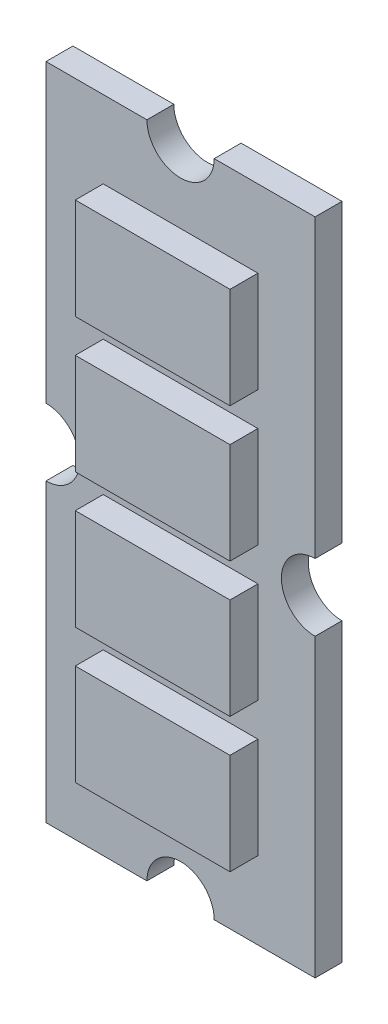
ISO-10303-21;
HEADER;
FILE_DESCRIPTION(('STEP AP214'),'2;1');
FILE_NAME('part.step','',(''),(''),'','','');
FILE_SCHEMA(('AUTOMOTIVE_DESIGN { 1 0 10303 214 1 1 1 1 }'));
ENDSEC;
DATA;
#1=APPLICATION_CONTEXT('core data for automotive mechanical design processes');
#2=APPLICATION_PROTOCOL_DEFINITION('international standard','automotive_design',2000,#1);
#3=PRODUCT_CONTEXT('',#1,'mechanical');
#4=PRODUCT('Part','Part','',(#3));
#5=PRODUCT_RELATED_PRODUCT_CATEGORY('part','',(#4));
#6=PRODUCT_DEFINITION_FORMATION('','',#4);
#7=PRODUCT_DEFINITION_CONTEXT('part definition',#1,'design');
#8=PRODUCT_DEFINITION('design','',#6,#7);
#9=PRODUCT_DEFINITION_SHAPE('','',#8);
#10=(LENGTH_UNIT() NAMED_UNIT(*) SI_UNIT(.MILLI.,.METRE.));
#11=(NAMED_UNIT(*) PLANE_ANGLE_UNIT() SI_UNIT($,.RADIAN.));
#12=(NAMED_UNIT(*) SI_UNIT($,.STERADIAN.) SOLID_ANGLE_UNIT());
#13=UNCERTAINTY_MEASURE_WITH_UNIT(LENGTH_MEASURE(1.E-05),#10,'distance_accuracy_value','');
#14=(GEOMETRIC_REPRESENTATION_CONTEXT(3) GLOBAL_UNCERTAINTY_ASSIGNED_CONTEXT((#13)) GLOBAL_UNIT_ASSIGNED_CONTEXT((#10,
#11,#12)) REPRESENTATION_CONTEXT('',''));
#15=CARTESIAN_POINT('',(0.,0.,0.));
#16=DIRECTION('',(0.,0.,1.));
#17=DIRECTION('',(1.,0.,0.));
#18=AXIS2_PLACEMENT_3D('',#15,#16,#17);
#19=CARTESIAN_POINT('',(-3.80238716478813,-26.6459336239174,0.8));
#20=DIRECTION('',(0.,0.,1.));
#21=DIRECTION('',(1.,0.,0.));
#22=AXIS2_PLACEMENT_3D('',#19,#20,#21);
#23=PLANE('',#22);
#24=DIRECTION('',(0.,-1.,0.));
#25=VECTOR('',#24,1.);
#26=CARTESIAN_POINT('',(-2.10238716478813,-19.1459336239174,0.8));
#27=LINE('',#26,#25);
#28=CARTESIAN_POINT('',(-2.10238716478813,-19.1459336239174,0.8));
#29=VERTEX_POINT('',#28);
#30=CARTESIAN_POINT('',(-2.10238716478813,-22.1459336239174,0.8));
#31=VERTEX_POINT('',#30);
#32=EDGE_CURVE('E318',#29,#31,#27,.T.);
#33=ORIENTED_EDGE('',*,*,#32,.F.);
#34=DIRECTION('',(-1.,0.,0.));
#35=VECTOR('',#34,1.);
#36=CARTESIAN_POINT('',(-2.10238716478813,-19.1459336239174,0.8));
#37=LINE('',#36,#35);
#38=CARTESIAN_POINT('',(2.49761283521187,-19.1459336239174,0.8));
#39=VERTEX_POINT('',#38);
#40=EDGE_CURVE('E323',#39,#29,#37,.T.);
#41=ORIENTED_EDGE('',*,*,#40,.F.);
#42=DIRECTION('',(0.,1.,0.));
#43=VECTOR('',#42,1.);
#44=CARTESIAN_POINT('',(2.49761283521187,-19.1459336239174,0.8));
#45=LINE('',#44,#43);
#46=CARTESIAN_POINT('',(2.49761283521188,-22.1459336239174,0.8));
#47=VERTEX_POINT('',#46);
#48=EDGE_CURVE('E335',#47,#39,#45,.T.);
#49=ORIENTED_EDGE('',*,*,#48,.F.);
#50=DIRECTION('',(1.,0.,0.));
#51=VECTOR('',#50,1.);
#52=CARTESIAN_POINT('',(-2.10238716478813,-22.1459336239174,0.8));
#53=LINE('',#52,#51);
#54=EDGE_CURVE('E332',#31,#47,#53,.T.);
#55=ORIENTED_EDGE('',*,*,#54,.F.);
#56=EDGE_LOOP('',(#33,#41,#49,#55));
#57=FACE_BOUND('',#56,.T.);
#58=DIRECTION('',(0.,-1.,0.));
#59=VECTOR('',#58,1.);
#60=CARTESIAN_POINT('',(-3.80238716478813,-16.8459336239174,0.8));
#61=LINE('',#60,#59);
#62=CARTESIAN_POINT('',(-3.80238716478813,-16.8459336239174,0.8));
#63=VERTEX_POINT('',#62);
#64=CARTESIAN_POINT('',(-3.80238716478813,-25.6459336239174,0.8));
#65=VERTEX_POINT('',#64);
#66=EDGE_CURVE('E352',#63,#65,#61,.T.);
#67=ORIENTED_EDGE('',*,*,#66,.T.);
#68=CARTESIAN_POINT('',(-3.80238716478813,-26.6459336239174,0.8));
#69=DIRECTION('',(0.,0.,-1.));
#70=DIRECTION('',(1.,0.,0.));
#71=AXIS2_PLACEMENT_3D('',#68,#69,#70);
#72=CIRCLE('',#71,1.);
#73=CARTESIAN_POINT('',(-3.80238716478813,-27.6459336239174,0.8));
#74=VERTEX_POINT('',#73);
#75=EDGE_CURVE('E355',#65,#74,#72,.T.);
#76=ORIENTED_EDGE('',*,*,#75,.T.);
#77=DIRECTION('',(0.,-1.,0.));
#78=VECTOR('',#77,1.);
#79=CARTESIAN_POINT('',(-3.80238716478813,-27.6459336239174,0.8));
#80=LINE('',#79,#78);
#81=CARTESIAN_POINT('',(-3.80238716478812,-36.4459336239174,0.8));
#82=VERTEX_POINT('',#81);
#83=EDGE_CURVE('E358',#74,#82,#80,.T.);
#84=ORIENTED_EDGE('',*,*,#83,.T.);
#85=DIRECTION('',(1.,0.,0.));
#86=VECTOR('',#85,1.);
#87=CARTESIAN_POINT('',(-3.80238716478812,-36.4459336239174,0.8));
#88=LINE('',#87,#86);
#89=CARTESIAN_POINT('',(-0.802387164788125,-36.4459336239174,0.8));
#90=VERTEX_POINT('',#89);
#91=EDGE_CURVE('E360',#82,#90,#88,.T.);
#92=ORIENTED_EDGE('',*,*,#91,.T.);
#93=CARTESIAN_POINT('',(0.197612835211876,-36.4459336239174,0.8));
#94=DIRECTION('',(0.,0.,-1.));
#95=DIRECTION('',(1.,0.,0.));
#96=AXIS2_PLACEMENT_3D('',#93,#94,#95);
#97=CIRCLE('',#96,1.);
#98=CARTESIAN_POINT('',(1.19761283521188,-36.4459336239174,0.8));
#99=VERTEX_POINT('',#98);
#100=EDGE_CURVE('E362',#90,#99,#97,.T.);
#101=ORIENTED_EDGE('',*,*,#100,.T.);
#102=DIRECTION('',(1.,0.,0.));
#103=VECTOR('',#102,1.);
#104=CARTESIAN_POINT('',(1.19761283521188,-36.4459336239174,0.8));
#105=LINE('',#104,#103);
#106=CARTESIAN_POINT('',(4.19761283521188,-36.4459336239174,0.8));
#107=VERTEX_POINT('',#106);
#108=EDGE_CURVE('E364',#99,#107,#105,.T.);
#109=ORIENTED_EDGE('',*,*,#108,.T.);
#110=DIRECTION('',(0.,1.,0.));
#111=VECTOR('',#110,1.);
#112=CARTESIAN_POINT('',(4.19761283521188,-27.6459336239174,0.8));
#113=LINE('',#112,#111);
#114=CARTESIAN_POINT('',(4.19761283521188,-27.6459336239174,0.8));
#115=VERTEX_POINT('',#114);
#116=EDGE_CURVE('E366',#107,#115,#113,.T.);
#117=ORIENTED_EDGE('',*,*,#116,.T.);
#118=CARTESIAN_POINT('',(4.19761283521188,-26.6459336239174,0.8));
#119=DIRECTION('',(0.,0.,-1.));
#120=DIRECTION('',(1.,0.,0.));
#121=AXIS2_PLACEMENT_3D('',#118,#119,#120);
#122=CIRCLE('',#121,1.);
#123=CARTESIAN_POINT('',(4.19761283521188,-25.6459336239174,0.8));
#124=VERTEX_POINT('',#123);
#125=EDGE_CURVE('E368',#115,#124,#122,.T.);
#126=ORIENTED_EDGE('',*,*,#125,.T.);
#127=DIRECTION('',(0.,1.,0.));
#128=VECTOR('',#127,1.);
#129=CARTESIAN_POINT('',(4.19761283521187,-16.8459336239174,0.8));
#130=LINE('',#129,#128);
#131=CARTESIAN_POINT('',(4.19761283521187,-16.8459336239174,0.8));
#132=VERTEX_POINT('',#131);
#133=EDGE_CURVE('E370',#124,#132,#130,.T.);
#134=ORIENTED_EDGE('',*,*,#133,.T.);
#135=DIRECTION('',(-1.,0.,0.));
#136=VECTOR('',#135,1.);
#137=CARTESIAN_POINT('',(1.19761283521187,-16.8459336239174,0.8));
#138=LINE('',#137,#136);
#139=CARTESIAN_POINT('',(1.19761283521187,-16.8459336239174,0.8));
#140=VERTEX_POINT('',#139);
#141=EDGE_CURVE('E372',#132,#140,#138,.T.);
#142=ORIENTED_EDGE('',*,*,#141,.T.);
#143=CARTESIAN_POINT('',(0.197612835211873,-16.8459336239174,0.8));
#144=DIRECTION('',(0.,0.,-1.));
#145=DIRECTION('',(1.,0.,0.));
#146=AXIS2_PLACEMENT_3D('',#143,#144,#145);
#147=CIRCLE('',#146,1.);
#148=CARTESIAN_POINT('',(-0.802387164788127,-16.8459336239174,0.8));
#149=VERTEX_POINT('',#148);
#150=EDGE_CURVE('E374',#140,#149,#147,.T.);
#151=ORIENTED_EDGE('',*,*,#150,.T.);
#152=DIRECTION('',(-1.,0.,0.));
#153=VECTOR('',#152,1.);
#154=CARTESIAN_POINT('',(-3.80238716478813,-16.8459336239174,0.8));
#155=LINE('',#154,#153);
#156=EDGE_CURVE('E376',#149,#63,#155,.T.);
#157=ORIENTED_EDGE('',*,*,#156,.T.);
#158=EDGE_LOOP('',(#67,#76,#84,#92,#101,#109,#117,#126,#134,#142,#151,#157));
#159=FACE_BOUND('',#158,.T.);
#160=DIRECTION('',(-1.,0.,0.));
#161=VECTOR('',#160,1.);
#162=CARTESIAN_POINT('',(-2.10238716478813,-31.1459336239174,0.8));
#163=LINE('',#162,#161);
#164=CARTESIAN_POINT('',(2.49761283521188,-31.1459336239174,0.8));
#165=VERTEX_POINT('',#164);
#166=CARTESIAN_POINT('',(-2.10238716478813,-31.1459336239174,0.8));
#167=VERTEX_POINT('',#166);
#168=EDGE_CURVE('E303',#165,#167,#163,.T.);
#169=ORIENTED_EDGE('',*,*,#168,.F.);
#170=DIRECTION('',(0.,1.,0.));
#171=VECTOR('',#170,1.);
#172=CARTESIAN_POINT('',(2.49761283521188,-31.1459336239174,0.8));
#173=LINE('',#172,#171);
#174=CARTESIAN_POINT('',(2.49761283521188,-34.1459336239174,0.8));
#175=VERTEX_POINT('',#174);
#176=EDGE_CURVE('E289',#175,#165,#173,.T.);
#177=ORIENTED_EDGE('',*,*,#176,.F.);
#178=DIRECTION('',(1.,0.,0.));
#179=VECTOR('',#178,1.);
#180=CARTESIAN_POINT('',(-2.10238716478812,-34.1459336239174,0.8));
#181=LINE('',#180,#179);
#182=CARTESIAN_POINT('',(-2.10238716478812,-34.1459336239174,0.8));
#183=VERTEX_POINT('',#182);
#184=EDGE_CURVE('E294',#183,#175,#181,.T.);
#185=ORIENTED_EDGE('',*,*,#184,.F.);
#186=DIRECTION('',(0.,-1.,0.));
#187=VECTOR('',#186,1.);
#188=CARTESIAN_POINT('',(-2.10238716478813,-31.1459336239174,0.8));
#189=LINE('',#188,#187);
#190=EDGE_CURVE('E305',#167,#183,#189,.T.);
#191=ORIENTED_EDGE('',*,*,#190,.F.);
#192=EDGE_LOOP('',(#169,#177,#185,#191));
#193=FACE_BOUND('',#192,.T.);
#194=DIRECTION('',(-1.,0.,0.));
#195=VECTOR('',#194,1.);
#196=CARTESIAN_POINT('',(-2.10238716478813,-23.1459336239174,0.8));
#197=LINE('',#196,#195);
#198=CARTESIAN_POINT('',(2.49761283521188,-23.1459336239174,0.8));
#199=VERTEX_POINT('',#198);
#200=CARTESIAN_POINT('',(-2.10238716478813,-23.1459336239174,0.8));
#201=VERTEX_POINT('',#200);
#202=EDGE_CURVE('E261',#199,#201,#197,.T.);
#203=ORIENTED_EDGE('',*,*,#202,.F.);
#204=DIRECTION('',(0.,1.,0.));
#205=VECTOR('',#204,1.);
#206=CARTESIAN_POINT('',(2.49761283521188,-23.1459336239174,0.8));
#207=LINE('',#206,#205);
#208=CARTESIAN_POINT('',(2.49761283521188,-26.1459336239174,0.8));
#209=VERTEX_POINT('',#208);
#210=EDGE_CURVE('E258',#209,#199,#207,.T.);
#211=ORIENTED_EDGE('',*,*,#210,.F.);
#212=DIRECTION('',(1.,0.,0.));
#213=VECTOR('',#212,1.);
#214=CARTESIAN_POINT('',(-2.10238716478813,-26.1459336239174,0.8));
#215=LINE('',#214,#213);
#216=CARTESIAN_POINT('',(-2.10238716478813,-26.1459336239174,0.8));
#217=VERTEX_POINT('',#216);
#218=EDGE_CURVE('E270',#217,#209,#215,.T.);
#219=ORIENTED_EDGE('',*,*,#218,.F.);
#220=DIRECTION('',(0.,-1.,0.));
#221=VECTOR('',#220,1.);
#222=CARTESIAN_POINT('',(-2.10238716478813,-23.1459336239174,0.8));
#223=LINE('',#222,#221);
#224=EDGE_CURVE('E278',#201,#217,#223,.T.);
#225=ORIENTED_EDGE('',*,*,#224,.F.);
#226=EDGE_LOOP('',(#203,#211,#219,#225));
#227=FACE_BOUND('',#226,.T.);
#228=DIRECTION('',(-1.,0.,0.));
#229=VECTOR('',#228,1.);
#230=CARTESIAN_POINT('',(-2.10238716478813,-27.1459336239174,0.8));
#231=LINE('',#230,#229);
#232=CARTESIAN_POINT('',(2.49761283521188,-27.1459336239174,0.8));
#233=VERTEX_POINT('',#232);
#234=CARTESIAN_POINT('',(-2.10238716478813,-27.1459336239174,0.8));
#235=VERTEX_POINT('',#234);
#236=EDGE_CURVE('E802',#233,#235,#231,.T.);
#237=ORIENTED_EDGE('',*,*,#236,.F.);
#238=DIRECTION('',(0.,1.,0.));
#239=VECTOR('',#238,1.);
#240=CARTESIAN_POINT('',(2.49761283521188,-27.1459336239174,0.8));
#241=LINE('',#240,#239);
#242=CARTESIAN_POINT('',(2.49761283521188,-30.1459336239174,0.8));
#243=VERTEX_POINT('',#242);
#244=EDGE_CURVE('E256',#243,#233,#241,.T.);
#245=ORIENTED_EDGE('',*,*,#244,.F.);
#246=DIRECTION('',(1.,0.,0.));
#247=VECTOR('',#246,1.);
#248=CARTESIAN_POINT('',(-2.10238716478813,-30.1459336239174,0.8));
#249=LINE('',#248,#247);
#250=CARTESIAN_POINT('',(-2.10238716478813,-30.1459336239174,0.8));
#251=VERTEX_POINT('',#250);
#252=EDGE_CURVE('E252',#251,#243,#249,.T.);
#253=ORIENTED_EDGE('',*,*,#252,.F.);
#254=DIRECTION('',(0.,-1.,0.));
#255=VECTOR('',#254,1.);
#256=CARTESIAN_POINT('',(-2.10238716478813,-27.1459336239174,0.8));
#257=LINE('',#256,#255);
#258=EDGE_CURVE('E799',#235,#251,#257,.T.);
#259=ORIENTED_EDGE('',*,*,#258,.F.);
#260=EDGE_LOOP('',(#237,#245,#253,#259));
#261=FACE_BOUND('',#260,.T.);
#262=ADVANCED_FACE('F47',(#57,#159,#193,#227,#261),#23,.T.);
#263=CARTESIAN_POINT('',(-3.80238716478813,-16.8459336239174,0.8));
#264=DIRECTION('',(1.,0.,0.));
#265=DIRECTION('',(0.,1.,0.));
#266=AXIS2_PLACEMENT_3D('',#263,#264,#265);
#267=PLANE('',#266);
#268=DIRECTION('',(0.,-1.,0.));
#269=VECTOR('',#268,1.);
#270=CARTESIAN_POINT('',(-3.80238716478813,-16.8459336239174,0.));
#271=LINE('',#270,#269);
#272=CARTESIAN_POINT('',(-3.80238716478813,-16.8459336239174,0.));
#273=VERTEX_POINT('',#272);
#274=CARTESIAN_POINT('',(-3.80238716478813,-25.6459336239174,0.));
#275=VERTEX_POINT('',#274);
#276=EDGE_CURVE('E351',#273,#275,#271,.T.);
#277=ORIENTED_EDGE('',*,*,#276,.T.);
#278=DIRECTION('',(0.,0.,-1.));
#279=VECTOR('',#278,1.);
#280=CARTESIAN_POINT('',(-3.80238716478813,-25.6459336239174,0.8));
#281=LINE('',#280,#279);
#282=EDGE_CURVE('E13',#65,#275,#281,.T.);
#283=ORIENTED_EDGE('',*,*,#282,.F.);
#284=ORIENTED_EDGE('',*,*,#66,.F.);
#285=DIRECTION('',(0.,0.,-1.));
#286=VECTOR('',#285,1.);
#287=CARTESIAN_POINT('',(-3.80238716478813,-16.8459336239174,0.8));
#288=LINE('',#287,#286);
#289=EDGE_CURVE('E378',#63,#273,#288,.T.);
#290=ORIENTED_EDGE('',*,*,#289,.T.);
#291=EDGE_LOOP('',(#277,#283,#284,#290));
#292=FACE_BOUND('',#291,.T.);
#293=ADVANCED_FACE('F49',(#292),#267,.F.);
#294=CARTESIAN_POINT('',(-3.80238716478813,-26.6459336239174,0.8));
#295=DIRECTION('',(0.,0.,-1.));
#296=DIRECTION('',(-1.,0.,0.));
#297=AXIS2_PLACEMENT_3D('',#294,#295,#296);
#298=CYLINDRICAL_SURFACE('',#297,1.);
#299=CARTESIAN_POINT('',(-3.80238716478813,-26.6459336239174,0.));
#300=DIRECTION('',(0.,0.,-1.));
#301=DIRECTION('',(1.,0.,0.));
#302=AXIS2_PLACEMENT_3D('',#299,#300,#301);
#303=CIRCLE('',#302,1.);
#304=CARTESIAN_POINT('',(-3.80238716478813,-27.6459336239174,0.));
#305=VERTEX_POINT('',#304);
#306=EDGE_CURVE('E381',#275,#305,#303,.T.);
#307=ORIENTED_EDGE('',*,*,#306,.T.);
#308=DIRECTION('',(0.,0.,-1.));
#309=VECTOR('',#308,1.);
#310=CARTESIAN_POINT('',(-3.80238716478813,-27.6459336239174,0.8));
#311=LINE('',#310,#309);
#312=EDGE_CURVE('E55',#74,#305,#311,.T.);
#313=ORIENTED_EDGE('',*,*,#312,.F.);
#314=ORIENTED_EDGE('',*,*,#75,.F.);
#315=ORIENTED_EDGE('',*,*,#282,.T.);
#316=EDGE_LOOP('',(#307,#313,#314,#315));
#317=FACE_BOUND('',#316,.T.);
#318=ADVANCED_FACE('F458',(#317),#298,.F.);
#319=CARTESIAN_POINT('',(-3.80238716478813,-27.6459336239174,0.8));
#320=DIRECTION('',(1.,0.,0.));
#321=DIRECTION('',(0.,1.,0.));
#322=AXIS2_PLACEMENT_3D('',#319,#320,#321);
#323=PLANE('',#322);
#324=DIRECTION('',(0.,-1.,0.));
#325=VECTOR('',#324,1.);
#326=CARTESIAN_POINT('',(-3.80238716478813,-27.6459336239174,0.));
#327=LINE('',#326,#325);
#328=CARTESIAN_POINT('',(-3.80238716478812,-36.4459336239174,0.));
#329=VERTEX_POINT('',#328);
#330=EDGE_CURVE('E383',#305,#329,#327,.T.);
#331=ORIENTED_EDGE('',*,*,#330,.T.);
#332=DIRECTION('',(0.,0.,-1.));
#333=VECTOR('',#332,1.);
#334=CARTESIAN_POINT('',(-3.80238716478812,-36.4459336239174,0.8));
#335=LINE('',#334,#333);
#336=EDGE_CURVE('E428',#82,#329,#335,.T.);
#337=ORIENTED_EDGE('',*,*,#336,.F.);
#338=ORIENTED_EDGE('',*,*,#83,.F.);
#339=ORIENTED_EDGE('',*,*,#312,.T.);
#340=EDGE_LOOP('',(#331,#337,#338,#339));
#341=FACE_BOUND('',#340,.T.);
#342=ADVANCED_FACE('F435',(#341),#323,.F.);
#343=CARTESIAN_POINT('',(-3.80238716478812,-36.4459336239174,0.8));
#344=DIRECTION('',(0.,1.,0.));
#345=DIRECTION('',(0.,0.,1.));
#346=AXIS2_PLACEMENT_3D('',#343,#344,#345);
#347=PLANE('',#346);
#348=DIRECTION('',(1.,0.,0.));
#349=VECTOR('',#348,1.);
#350=CARTESIAN_POINT('',(-3.80238716478812,-36.4459336239174,0.));
#351=LINE('',#350,#349);
#352=CARTESIAN_POINT('',(-0.802387164788125,-36.4459336239174,0.));
#353=VERTEX_POINT('',#352);
#354=EDGE_CURVE('E385',#329,#353,#351,.T.);
#355=ORIENTED_EDGE('',*,*,#354,.T.);
#356=DIRECTION('',(0.,0.,-1.));
#357=VECTOR('',#356,1.);
#358=CARTESIAN_POINT('',(-0.802387164788125,-36.4459336239174,0.8));
#359=LINE('',#358,#357);
#360=EDGE_CURVE('E425',#90,#353,#359,.T.);
#361=ORIENTED_EDGE('',*,*,#360,.F.);
#362=ORIENTED_EDGE('',*,*,#91,.F.);
#363=ORIENTED_EDGE('',*,*,#336,.T.);
#364=EDGE_LOOP('',(#355,#361,#362,#363));
#365=FACE_BOUND('',#364,.T.);
#366=ADVANCED_FACE('F446',(#365),#347,.F.);
#367=CARTESIAN_POINT('',(0.197612835211876,-36.4459336239174,0.8));
#368=DIRECTION('',(0.,0.,-1.));
#369=DIRECTION('',(-1.,0.,0.));
#370=AXIS2_PLACEMENT_3D('',#367,#368,#369);
#371=CYLINDRICAL_SURFACE('',#370,1.);
#372=CARTESIAN_POINT('',(0.197612835211876,-36.4459336239174,0.));
#373=DIRECTION('',(0.,0.,-1.));
#374=DIRECTION('',(1.,0.,0.));
#375=AXIS2_PLACEMENT_3D('',#372,#373,#374);
#376=CIRCLE('',#375,1.);
#377=CARTESIAN_POINT('',(1.19761283521188,-36.4459336239174,0.));
#378=VERTEX_POINT('',#377);
#379=EDGE_CURVE('E387',#353,#378,#376,.T.);
#380=ORIENTED_EDGE('',*,*,#379,.T.);
#381=DIRECTION('',(0.,0.,-1.));
#382=VECTOR('',#381,1.);
#383=CARTESIAN_POINT('',(1.19761283521188,-36.4459336239174,0.8));
#384=LINE('',#383,#382);
#385=EDGE_CURVE('E422',#99,#378,#384,.T.);
#386=ORIENTED_EDGE('',*,*,#385,.F.);
#387=ORIENTED_EDGE('',*,*,#100,.F.);
#388=ORIENTED_EDGE('',*,*,#360,.T.);
#389=EDGE_LOOP('',(#380,#386,#387,#388));
#390=FACE_BOUND('',#389,.T.);
#391=ADVANCED_FACE('F450',(#390),#371,.F.);
#392=CARTESIAN_POINT('',(1.19761283521188,-36.4459336239174,0.8));
#393=DIRECTION('',(0.,1.,0.));
#394=DIRECTION('',(0.,0.,1.));
#395=AXIS2_PLACEMENT_3D('',#392,#393,#394);
#396=PLANE('',#395);
#397=DIRECTION('',(1.,0.,0.));
#398=VECTOR('',#397,1.);
#399=CARTESIAN_POINT('',(1.19761283521188,-36.4459336239174,0.));
#400=LINE('',#399,#398);
#401=CARTESIAN_POINT('',(4.19761283521188,-36.4459336239174,0.));
#402=VERTEX_POINT('',#401);
#403=EDGE_CURVE('E389',#378,#402,#400,.T.);
#404=ORIENTED_EDGE('',*,*,#403,.T.);
#405=DIRECTION('',(0.,0.,-1.));
#406=VECTOR('',#405,1.);
#407=CARTESIAN_POINT('',(4.19761283521188,-36.4459336239174,0.8));
#408=LINE('',#407,#406);
#409=EDGE_CURVE('E419',#107,#402,#408,.T.);
#410=ORIENTED_EDGE('',*,*,#409,.F.);
#411=ORIENTED_EDGE('',*,*,#108,.F.);
#412=ORIENTED_EDGE('',*,*,#385,.T.);
#413=EDGE_LOOP('',(#404,#410,#411,#412));
#414=FACE_BOUND('',#413,.T.);
#415=ADVANCED_FACE('F491',(#414),#396,.F.);
#416=CARTESIAN_POINT('',(4.19761283521188,-27.6459336239174,0.8));
#417=DIRECTION('',(-1.,0.,0.));
#418=DIRECTION('',(0.,-1.,0.));
#419=AXIS2_PLACEMENT_3D('',#416,#417,#418);
#420=PLANE('',#419);
#421=DIRECTION('',(0.,1.,0.));
#422=VECTOR('',#421,1.);
#423=CARTESIAN_POINT('',(4.19761283521188,-27.6459336239174,0.));
#424=LINE('',#423,#422);
#425=CARTESIAN_POINT('',(4.19761283521188,-27.6459336239174,0.));
#426=VERTEX_POINT('',#425);
#427=EDGE_CURVE('E391',#402,#426,#424,.T.);
#428=ORIENTED_EDGE('',*,*,#427,.T.);
#429=DIRECTION('',(0.,0.,-1.));
#430=VECTOR('',#429,1.);
#431=CARTESIAN_POINT('',(4.19761283521188,-27.6459336239174,0.8));
#432=LINE('',#431,#430);
#433=EDGE_CURVE('E416',#115,#426,#432,.T.);
#434=ORIENTED_EDGE('',*,*,#433,.F.);
#435=ORIENTED_EDGE('',*,*,#116,.F.);
#436=ORIENTED_EDGE('',*,*,#409,.T.);
#437=EDGE_LOOP('',(#428,#434,#435,#436));
#438=FACE_BOUND('',#437,.T.);
#439=ADVANCED_FACE('F489',(#438),#420,.F.);
#440=CARTESIAN_POINT('',(4.19761283521188,-26.6459336239174,0.8));
#441=DIRECTION('',(0.,0.,-1.));
#442=DIRECTION('',(-1.,0.,0.));
#443=AXIS2_PLACEMENT_3D('',#440,#441,#442);
#444=CYLINDRICAL_SURFACE('',#443,1.);
#445=CARTESIAN_POINT('',(4.19761283521188,-26.6459336239174,0.));
#446=DIRECTION('',(0.,0.,-1.));
#447=DIRECTION('',(1.,0.,0.));
#448=AXIS2_PLACEMENT_3D('',#445,#446,#447);
#449=CIRCLE('',#448,1.);
#450=CARTESIAN_POINT('',(4.19761283521188,-25.6459336239174,0.));
#451=VERTEX_POINT('',#450);
#452=EDGE_CURVE('E393',#426,#451,#449,.T.);
#453=ORIENTED_EDGE('',*,*,#452,.T.);
#454=DIRECTION('',(0.,0.,-1.));
#455=VECTOR('',#454,1.);
#456=CARTESIAN_POINT('',(4.19761283521188,-25.6459336239174,0.8));
#457=LINE('',#456,#455);
#458=EDGE_CURVE('E413',#124,#451,#457,.T.);
#459=ORIENTED_EDGE('',*,*,#458,.F.);
#460=ORIENTED_EDGE('',*,*,#125,.F.);
#461=ORIENTED_EDGE('',*,*,#433,.T.);
#462=EDGE_LOOP('',(#453,#459,#460,#461));
#463=FACE_BOUND('',#462,.T.);
#464=ADVANCED_FACE('F485',(#463),#444,.F.);
#465=CARTESIAN_POINT('',(4.19761283521187,-16.8459336239174,0.8));
#466=DIRECTION('',(-1.,0.,0.));
#467=DIRECTION('',(0.,-1.,0.));
#468=AXIS2_PLACEMENT_3D('',#465,#466,#467);
#469=PLANE('',#468);
#470=DIRECTION('',(0.,1.,0.));
#471=VECTOR('',#470,1.);
#472=CARTESIAN_POINT('',(4.19761283521187,-16.8459336239174,0.));
#473=LINE('',#472,#471);
#474=CARTESIAN_POINT('',(4.19761283521187,-16.8459336239174,0.));
#475=VERTEX_POINT('',#474);
#476=EDGE_CURVE('E395',#451,#475,#473,.T.);
#477=ORIENTED_EDGE('',*,*,#476,.T.);
#478=DIRECTION('',(0.,0.,-1.));
#479=VECTOR('',#478,1.);
#480=CARTESIAN_POINT('',(4.19761283521187,-16.8459336239174,0.8));
#481=LINE('',#480,#479);
#482=EDGE_CURVE('E410',#132,#475,#481,.T.);
#483=ORIENTED_EDGE('',*,*,#482,.F.);
#484=ORIENTED_EDGE('',*,*,#133,.F.);
#485=ORIENTED_EDGE('',*,*,#458,.T.);
#486=EDGE_LOOP('',(#477,#483,#484,#485));
#487=FACE_BOUND('',#486,.T.);
#488=ADVANCED_FACE('F480',(#487),#469,.F.);
#489=CARTESIAN_POINT('',(1.19761283521187,-16.8459336239174,0.8));
#490=DIRECTION('',(0.,-1.,0.));
#491=DIRECTION('',(0.,0.,-1.));
#492=AXIS2_PLACEMENT_3D('',#489,#490,#491);
#493=PLANE('',#492);
#494=DIRECTION('',(-1.,0.,0.));
#495=VECTOR('',#494,1.);
#496=CARTESIAN_POINT('',(1.19761283521187,-16.8459336239174,0.));
#497=LINE('',#496,#495);
#498=CARTESIAN_POINT('',(1.19761283521187,-16.8459336239174,0.));
#499=VERTEX_POINT('',#498);
#500=EDGE_CURVE('E397',#475,#499,#497,.T.);
#501=ORIENTED_EDGE('',*,*,#500,.T.);
#502=DIRECTION('',(0.,0.,-1.));
#503=VECTOR('',#502,1.);
#504=CARTESIAN_POINT('',(1.19761283521187,-16.8459336239174,0.8));
#505=LINE('',#504,#503);
#506=EDGE_CURVE('E407',#140,#499,#505,.T.);
#507=ORIENTED_EDGE('',*,*,#506,.F.);
#508=ORIENTED_EDGE('',*,*,#141,.F.);
#509=ORIENTED_EDGE('',*,*,#482,.T.);
#510=EDGE_LOOP('',(#501,#507,#508,#509));
#511=FACE_BOUND('',#510,.T.);
#512=ADVANCED_FACE('F474',(#511),#493,.F.);
#513=CARTESIAN_POINT('',(0.197612835211873,-16.8459336239174,0.8));
#514=DIRECTION('',(0.,0.,-1.));
#515=DIRECTION('',(-1.,0.,0.));
#516=AXIS2_PLACEMENT_3D('',#513,#514,#515);
#517=CYLINDRICAL_SURFACE('',#516,1.);
#518=CARTESIAN_POINT('',(0.197612835211873,-16.8459336239174,0.));
#519=DIRECTION('',(0.,0.,-1.));
#520=DIRECTION('',(1.,0.,0.));
#521=AXIS2_PLACEMENT_3D('',#518,#519,#520);
#522=CIRCLE('',#521,1.);
#523=CARTESIAN_POINT('',(-0.802387164788127,-16.8459336239174,0.));
#524=VERTEX_POINT('',#523);
#525=EDGE_CURVE('E399',#499,#524,#522,.T.);
#526=ORIENTED_EDGE('',*,*,#525,.T.);
#527=DIRECTION('',(0.,0.,-1.));
#528=VECTOR('',#527,1.);
#529=CARTESIAN_POINT('',(-0.802387164788127,-16.8459336239174,0.8));
#530=LINE('',#529,#528);
#531=EDGE_CURVE('E404',#149,#524,#530,.T.);
#532=ORIENTED_EDGE('',*,*,#531,.F.);
#533=ORIENTED_EDGE('',*,*,#150,.F.);
#534=ORIENTED_EDGE('',*,*,#506,.T.);
#535=EDGE_LOOP('',(#526,#532,#533,#534));
#536=FACE_BOUND('',#535,.T.);
#537=ADVANCED_FACE('F470',(#536),#517,.F.);
#538=CARTESIAN_POINT('',(-3.80238716478813,-16.8459336239174,0.8));
#539=DIRECTION('',(0.,-1.,0.));
#540=DIRECTION('',(0.,0.,-1.));
#541=AXIS2_PLACEMENT_3D('',#538,#539,#540);
#542=PLANE('',#541);
#543=DIRECTION('',(-1.,0.,0.));
#544=VECTOR('',#543,1.);
#545=CARTESIAN_POINT('',(-3.80238716478813,-16.8459336239174,0.));
#546=LINE('',#545,#544);
#547=EDGE_CURVE('E356',#524,#273,#546,.T.);
#548=ORIENTED_EDGE('',*,*,#547,.T.);
#549=ORIENTED_EDGE('',*,*,#289,.F.);
#550=ORIENTED_EDGE('',*,*,#156,.F.);
#551=ORIENTED_EDGE('',*,*,#531,.T.);
#552=EDGE_LOOP('',(#548,#549,#550,#551));
#553=FACE_BOUND('',#552,.T.);
#554=ADVANCED_FACE('F465',(#553),#542,.F.);
#555=CARTESIAN_POINT('',(-3.80238716478813,-26.6459336239174,0.));
#556=DIRECTION('',(0.,0.,1.));
#557=DIRECTION('',(1.,0.,0.));
#558=AXIS2_PLACEMENT_3D('',#555,#556,#557);
#559=PLANE('',#558);
#560=ORIENTED_EDGE('',*,*,#276,.F.);
#561=ORIENTED_EDGE('',*,*,#547,.F.);
#562=ORIENTED_EDGE('',*,*,#525,.F.);
#563=ORIENTED_EDGE('',*,*,#500,.F.);
#564=ORIENTED_EDGE('',*,*,#476,.F.);
#565=ORIENTED_EDGE('',*,*,#452,.F.);
#566=ORIENTED_EDGE('',*,*,#427,.F.);
#567=ORIENTED_EDGE('',*,*,#403,.F.);
#568=ORIENTED_EDGE('',*,*,#379,.F.);
#569=ORIENTED_EDGE('',*,*,#354,.F.);
#570=ORIENTED_EDGE('',*,*,#330,.F.);
#571=ORIENTED_EDGE('',*,*,#306,.F.);
#572=EDGE_LOOP('',(#560,#561,#562,#563,#564,#565,#566,#567,#568,#569,#570,#571));
#573=FACE_BOUND('',#572,.T.);
#574=ADVANCED_FACE('F441',(#573),#559,.F.);
#575=CARTESIAN_POINT('',(-2.10238716478813,-19.1459336239174,1.63));
#576=DIRECTION('',(1.,0.,0.));
#577=DIRECTION('',(0.,1.,0.));
#578=AXIS2_PLACEMENT_3D('',#575,#576,#577);
#579=PLANE('',#578);
#580=ORIENTED_EDGE('',*,*,#32,.T.);
#581=DIRECTION('',(0.,0.,-1.));
#582=VECTOR('',#581,1.);
#583=CARTESIAN_POINT('',(-2.10238716478813,-22.1459336239174,1.63));
#584=LINE('',#583,#582);
#585=CARTESIAN_POINT('',(-2.10238716478813,-22.1459336239174,1.63));
#586=VERTEX_POINT('',#585);
#587=EDGE_CURVE('E348',#586,#31,#584,.T.);
#588=ORIENTED_EDGE('',*,*,#587,.F.);
#589=DIRECTION('',(0.,-1.,0.));
#590=VECTOR('',#589,1.);
#591=CARTESIAN_POINT('',(-2.10238716478813,-19.1459336239174,1.63));
#592=LINE('',#591,#590);
#593=CARTESIAN_POINT('',(-2.10238716478813,-19.1459336239174,1.63));
#594=VERTEX_POINT('',#593);
#595=EDGE_CURVE('E319',#594,#586,#592,.T.);
#596=ORIENTED_EDGE('',*,*,#595,.F.);
#597=DIRECTION('',(0.,0.,-1.));
#598=VECTOR('',#597,1.);
#599=CARTESIAN_POINT('',(-2.10238716478813,-19.1459336239174,1.63));
#600=LINE('',#599,#598);
#601=EDGE_CURVE('E329',#594,#29,#600,.T.);
#602=ORIENTED_EDGE('',*,*,#601,.T.);
#603=EDGE_LOOP('',(#580,#588,#596,#602));
#604=FACE_BOUND('',#603,.T.);
#605=ADVANCED_FACE('F508',(#604),#579,.F.);
#606=CARTESIAN_POINT('',(-2.10238716478813,-22.1459336239174,1.63));
#607=DIRECTION('',(0.,1.,0.));
#608=DIRECTION('',(0.,0.,1.));
#609=AXIS2_PLACEMENT_3D('',#606,#607,#608);
#610=PLANE('',#609);
#611=ORIENTED_EDGE('',*,*,#54,.T.);
#612=DIRECTION('',(0.,0.,-1.));
#613=VECTOR('',#612,1.);
#614=CARTESIAN_POINT('',(2.49761283521188,-22.1459336239174,1.63));
#615=LINE('',#614,#613);
#616=CARTESIAN_POINT('',(2.49761283521188,-22.1459336239174,1.63));
#617=VERTEX_POINT('',#616);
#618=EDGE_CURVE('E345',#617,#47,#615,.T.);
#619=ORIENTED_EDGE('',*,*,#618,.F.);
#620=DIRECTION('',(1.,0.,0.));
#621=VECTOR('',#620,1.);
#622=CARTESIAN_POINT('',(-2.10238716478813,-22.1459336239174,1.63));
#623=LINE('',#622,#621);
#624=EDGE_CURVE('E322',#586,#617,#623,.T.);
#625=ORIENTED_EDGE('',*,*,#624,.F.);
#626=ORIENTED_EDGE('',*,*,#587,.T.);
#627=EDGE_LOOP('',(#611,#619,#625,#626));
#628=FACE_BOUND('',#627,.T.);
#629=ADVANCED_FACE('F551',(#628),#610,.F.);
#630=CARTESIAN_POINT('',(2.49761283521187,-19.1459336239174,1.63));
#631=DIRECTION('',(-1.,0.,0.));
#632=DIRECTION('',(0.,-1.,0.));
#633=AXIS2_PLACEMENT_3D('',#630,#631,#632);
#634=PLANE('',#633);
#635=ORIENTED_EDGE('',*,*,#48,.T.);
#636=DIRECTION('',(0.,0.,-1.));
#637=VECTOR('',#636,1.);
#638=CARTESIAN_POINT('',(2.49761283521187,-19.1459336239174,1.63));
#639=LINE('',#638,#637);
#640=CARTESIAN_POINT('',(2.49761283521187,-19.1459336239174,1.63));
#641=VERTEX_POINT('',#640);
#642=EDGE_CURVE('E342',#641,#39,#639,.T.);
#643=ORIENTED_EDGE('',*,*,#642,.F.);
#644=DIRECTION('',(0.,1.,0.));
#645=VECTOR('',#644,1.);
#646=CARTESIAN_POINT('',(2.49761283521187,-19.1459336239174,1.63));
#647=LINE('',#646,#645);
#648=EDGE_CURVE('E325',#617,#641,#647,.T.);
#649=ORIENTED_EDGE('',*,*,#648,.F.);
#650=ORIENTED_EDGE('',*,*,#618,.T.);
#651=EDGE_LOOP('',(#635,#643,#649,#650));
#652=FACE_BOUND('',#651,.T.);
#653=ADVANCED_FACE('F558',(#652),#634,.F.);
#654=CARTESIAN_POINT('',(-2.10238716478813,-19.1459336239174,1.63));
#655=DIRECTION('',(0.,-1.,0.));
#656=DIRECTION('',(0.,0.,-1.));
#657=AXIS2_PLACEMENT_3D('',#654,#655,#656);
#658=PLANE('',#657);
#659=ORIENTED_EDGE('',*,*,#40,.T.);
#660=ORIENTED_EDGE('',*,*,#601,.F.);
#661=DIRECTION('',(-1.,0.,0.));
#662=VECTOR('',#661,1.);
#663=CARTESIAN_POINT('',(-2.10238716478813,-19.1459336239174,1.63));
#664=LINE('',#663,#662);
#665=EDGE_CURVE('E327',#641,#594,#664,.T.);
#666=ORIENTED_EDGE('',*,*,#665,.F.);
#667=ORIENTED_EDGE('',*,*,#642,.T.);
#668=EDGE_LOOP('',(#659,#660,#666,#667));
#669=FACE_BOUND('',#668,.T.);
#670=ADVANCED_FACE('F565',(#669),#658,.F.);
#671=CARTESIAN_POINT('',(0.,0.,1.63));
#672=DIRECTION('',(0.,0.,1.));
#673=DIRECTION('',(1.,0.,0.));
#674=AXIS2_PLACEMENT_3D('',#671,#672,#673);
#675=PLANE('',#674);
#676=ORIENTED_EDGE('',*,*,#595,.T.);
#677=ORIENTED_EDGE('',*,*,#624,.T.);
#678=ORIENTED_EDGE('',*,*,#648,.T.);
#679=ORIENTED_EDGE('',*,*,#665,.T.);
#680=EDGE_LOOP('',(#676,#677,#678,#679));
#681=FACE_BOUND('',#680,.T.);
#682=ADVANCED_FACE('F573',(#681),#675,.T.);
#683=CARTESIAN_POINT('',(2.49761283521188,-31.1459336239174,1.63));
#684=DIRECTION('',(-1.,0.,0.));
#685=DIRECTION('',(0.,-1.,0.));
#686=AXIS2_PLACEMENT_3D('',#683,#684,#685);
#687=PLANE('',#686);
#688=ORIENTED_EDGE('',*,*,#176,.T.);
#689=DIRECTION('',(0.,0.,-1.));
#690=VECTOR('',#689,1.);
#691=CARTESIAN_POINT('',(2.49761283521188,-31.1459336239174,1.63));
#692=LINE('',#691,#690);
#693=CARTESIAN_POINT('',(2.49761283521188,-31.1459336239174,1.63));
#694=VERTEX_POINT('',#693);
#695=EDGE_CURVE('E316',#694,#165,#692,.T.);
#696=ORIENTED_EDGE('',*,*,#695,.F.);
#697=DIRECTION('',(0.,1.,0.));
#698=VECTOR('',#697,1.);
#699=CARTESIAN_POINT('',(2.49761283521188,-31.1459336239174,1.63));
#700=LINE('',#699,#698);
#701=CARTESIAN_POINT('',(2.49761283521188,-34.1459336239174,1.63));
#702=VERTEX_POINT('',#701);
#703=EDGE_CURVE('E290',#702,#694,#700,.T.);
#704=ORIENTED_EDGE('',*,*,#703,.F.);
#705=DIRECTION('',(0.,0.,-1.));
#706=VECTOR('',#705,1.);
#707=CARTESIAN_POINT('',(2.49761283521188,-34.1459336239174,1.63));
#708=LINE('',#707,#706);
#709=EDGE_CURVE('E300',#702,#175,#708,.T.);
#710=ORIENTED_EDGE('',*,*,#709,.T.);
#711=EDGE_LOOP('',(#688,#696,#704,#710));
#712=FACE_BOUND('',#711,.T.);
#713=ADVANCED_FACE('F581',(#712),#687,.F.);
#714=CARTESIAN_POINT('',(-2.10238716478813,-31.1459336239174,1.63));
#715=DIRECTION('',(0.,-1.,0.));
#716=DIRECTION('',(0.,0.,-1.));
#717=AXIS2_PLACEMENT_3D('',#714,#715,#716);
#718=PLANE('',#717);
#719=ORIENTED_EDGE('',*,*,#168,.T.);
#720=DIRECTION('',(0.,0.,-1.));
#721=VECTOR('',#720,1.);
#722=CARTESIAN_POINT('',(-2.10238716478813,-31.1459336239174,1.63));
#723=LINE('',#722,#721);
#724=CARTESIAN_POINT('',(-2.10238716478813,-31.1459336239174,1.63));
#725=VERTEX_POINT('',#724);
#726=EDGE_CURVE('E313',#725,#167,#723,.T.);
#727=ORIENTED_EDGE('',*,*,#726,.F.);
#728=DIRECTION('',(-1.,0.,0.));
#729=VECTOR('',#728,1.);
#730=CARTESIAN_POINT('',(-2.10238716478813,-31.1459336239174,1.63));
#731=LINE('',#730,#729);
#732=EDGE_CURVE('E293',#694,#725,#731,.T.);
#733=ORIENTED_EDGE('',*,*,#732,.F.);
#734=ORIENTED_EDGE('',*,*,#695,.T.);
#735=EDGE_LOOP('',(#719,#727,#733,#734));
#736=FACE_BOUND('',#735,.T.);
#737=ADVANCED_FACE('F589',(#736),#718,.F.);
#738=CARTESIAN_POINT('',(-2.10238716478813,-31.1459336239174,1.63));
#739=DIRECTION('',(1.,0.,0.));
#740=DIRECTION('',(0.,1.,0.));
#741=AXIS2_PLACEMENT_3D('',#738,#739,#740);
#742=PLANE('',#741);
#743=ORIENTED_EDGE('',*,*,#190,.T.);
#744=DIRECTION('',(0.,0.,-1.));
#745=VECTOR('',#744,1.);
#746=CARTESIAN_POINT('',(-2.10238716478812,-34.1459336239174,1.63));
#747=LINE('',#746,#745);
#748=CARTESIAN_POINT('',(-2.10238716478812,-34.1459336239174,1.63));
#749=VERTEX_POINT('',#748);
#750=EDGE_CURVE('E311',#749,#183,#747,.T.);
#751=ORIENTED_EDGE('',*,*,#750,.F.);
#752=DIRECTION('',(0.,-1.,0.));
#753=VECTOR('',#752,1.);
#754=CARTESIAN_POINT('',(-2.10238716478813,-31.1459336239174,1.63));
#755=LINE('',#754,#753);
#756=EDGE_CURVE('E296',#725,#749,#755,.T.);
#757=ORIENTED_EDGE('',*,*,#756,.F.);
#758=ORIENTED_EDGE('',*,*,#726,.T.);
#759=EDGE_LOOP('',(#743,#751,#757,#758));
#760=FACE_BOUND('',#759,.T.);
#761=ADVANCED_FACE('F597',(#760),#742,.F.);
#762=CARTESIAN_POINT('',(-2.10238716478812,-34.1459336239174,1.63));
#763=DIRECTION('',(0.,1.,0.));
#764=DIRECTION('',(0.,0.,1.));
#765=AXIS2_PLACEMENT_3D('',#762,#763,#764);
#766=PLANE('',#765);
#767=ORIENTED_EDGE('',*,*,#184,.T.);
#768=ORIENTED_EDGE('',*,*,#709,.F.);
#769=DIRECTION('',(1.,0.,0.));
#770=VECTOR('',#769,1.);
#771=CARTESIAN_POINT('',(-2.10238716478812,-34.1459336239174,1.63));
#772=LINE('',#771,#770);
#773=EDGE_CURVE('E298',#749,#702,#772,.T.);
#774=ORIENTED_EDGE('',*,*,#773,.F.);
#775=ORIENTED_EDGE('',*,*,#750,.T.);
#776=EDGE_LOOP('',(#767,#768,#774,#775));
#777=FACE_BOUND('',#776,.T.);
#778=ADVANCED_FACE('F605',(#777),#766,.F.);
#779=CARTESIAN_POINT('',(0.,0.,1.63));
#780=DIRECTION('',(0.,0.,1.));
#781=DIRECTION('',(1.,0.,0.));
#782=AXIS2_PLACEMENT_3D('',#779,#780,#781);
#783=PLANE('',#782);
#784=ORIENTED_EDGE('',*,*,#703,.T.);
#785=ORIENTED_EDGE('',*,*,#732,.T.);
#786=ORIENTED_EDGE('',*,*,#756,.T.);
#787=ORIENTED_EDGE('',*,*,#773,.T.);
#788=EDGE_LOOP('',(#784,#785,#786,#787));
#789=FACE_BOUND('',#788,.T.);
#790=ADVANCED_FACE('F613',(#789),#783,.T.);
#791=CARTESIAN_POINT('',(2.49761283521188,-23.1459336239174,1.63));
#792=DIRECTION('',(-1.,0.,0.));
#793=DIRECTION('',(0.,-1.,0.));
#794=AXIS2_PLACEMENT_3D('',#791,#792,#793);
#795=PLANE('',#794);
#796=ORIENTED_EDGE('',*,*,#210,.T.);
#797=DIRECTION('',(0.,0.,-1.));
#798=VECTOR('',#797,1.);
#799=CARTESIAN_POINT('',(2.49761283521188,-23.1459336239174,1.63));
#800=LINE('',#799,#798);
#801=CARTESIAN_POINT('',(2.49761283521188,-23.1459336239174,1.63));
#802=VERTEX_POINT('',#801);
#803=EDGE_CURVE('E287',#802,#199,#800,.T.);
#804=ORIENTED_EDGE('',*,*,#803,.F.);
#805=DIRECTION('',(0.,1.,0.));
#806=VECTOR('',#805,1.);
#807=CARTESIAN_POINT('',(2.49761283521188,-23.1459336239174,1.63));
#808=LINE('',#807,#806);
#809=CARTESIAN_POINT('',(2.49761283521188,-26.1459336239174,1.63));
#810=VERTEX_POINT('',#809);
#811=EDGE_CURVE('E266',#810,#802,#808,.T.);
#812=ORIENTED_EDGE('',*,*,#811,.F.);
#813=DIRECTION('',(0.,0.,-1.));
#814=VECTOR('',#813,1.);
#815=CARTESIAN_POINT('',(2.49761283521188,-26.1459336239174,1.63));
#816=LINE('',#815,#814);
#817=EDGE_CURVE('E275',#810,#209,#816,.T.);
#818=ORIENTED_EDGE('',*,*,#817,.T.);
#819=EDGE_LOOP('',(#796,#804,#812,#818));
#820=FACE_BOUND('',#819,.T.);
#821=ADVANCED_FACE('F621',(#820),#795,.F.);
#822=CARTESIAN_POINT('',(-2.10238716478813,-23.1459336239174,1.63));
#823=DIRECTION('',(0.,-1.,0.));
#824=DIRECTION('',(0.,0.,-1.));
#825=AXIS2_PLACEMENT_3D('',#822,#823,#824);
#826=PLANE('',#825);
#827=ORIENTED_EDGE('',*,*,#202,.T.);
#828=DIRECTION('',(0.,0.,-1.));
#829=VECTOR('',#828,1.);
#830=CARTESIAN_POINT('',(-2.10238716478813,-23.1459336239174,1.63));
#831=LINE('',#830,#829);
#832=CARTESIAN_POINT('',(-2.10238716478813,-23.1459336239174,1.63));
#833=VERTEX_POINT('',#832);
#834=EDGE_CURVE('E284',#833,#201,#831,.T.);
#835=ORIENTED_EDGE('',*,*,#834,.F.);
#836=DIRECTION('',(-1.,0.,0.));
#837=VECTOR('',#836,1.);
#838=CARTESIAN_POINT('',(-2.10238716478813,-23.1459336239174,1.63));
#839=LINE('',#838,#837);
#840=EDGE_CURVE('E269',#802,#833,#839,.T.);
#841=ORIENTED_EDGE('',*,*,#840,.F.);
#842=ORIENTED_EDGE('',*,*,#803,.T.);
#843=EDGE_LOOP('',(#827,#835,#841,#842));
#844=FACE_BOUND('',#843,.T.);
#845=ADVANCED_FACE('F629',(#844),#826,.F.);
#846=CARTESIAN_POINT('',(-2.10238716478813,-23.1459336239174,1.63));
#847=DIRECTION('',(1.,0.,0.));
#848=DIRECTION('',(0.,1.,0.));
#849=AXIS2_PLACEMENT_3D('',#846,#847,#848);
#850=PLANE('',#849);
#851=ORIENTED_EDGE('',*,*,#224,.T.);
#852=DIRECTION('',(0.,0.,-1.));
#853=VECTOR('',#852,1.);
#854=CARTESIAN_POINT('',(-2.10238716478813,-26.1459336239174,1.63));
#855=LINE('',#854,#853);
#856=CARTESIAN_POINT('',(-2.10238716478813,-26.1459336239174,1.63));
#857=VERTEX_POINT('',#856);
#858=EDGE_CURVE('E70',#857,#217,#855,.T.);
#859=ORIENTED_EDGE('',*,*,#858,.F.);
#860=DIRECTION('',(0.,-1.,0.));
#861=VECTOR('',#860,1.);
#862=CARTESIAN_POINT('',(-2.10238716478813,-23.1459336239174,1.63));
#863=LINE('',#862,#861);
#864=EDGE_CURVE('E272',#833,#857,#863,.T.);
#865=ORIENTED_EDGE('',*,*,#864,.F.);
#866=ORIENTED_EDGE('',*,*,#834,.T.);
#867=EDGE_LOOP('',(#851,#859,#865,#866));
#868=FACE_BOUND('',#867,.T.);
#869=ADVANCED_FACE('F637',(#868),#850,.F.);
#870=CARTESIAN_POINT('',(-2.10238716478813,-26.1459336239174,1.63));
#871=DIRECTION('',(0.,1.,0.));
#872=DIRECTION('',(0.,0.,1.));
#873=AXIS2_PLACEMENT_3D('',#870,#871,#872);
#874=PLANE('',#873);
#875=ORIENTED_EDGE('',*,*,#218,.T.);
#876=ORIENTED_EDGE('',*,*,#817,.F.);
#877=DIRECTION('',(1.,0.,0.));
#878=VECTOR('',#877,1.);
#879=CARTESIAN_POINT('',(-2.10238716478813,-26.1459336239174,1.63));
#880=LINE('',#879,#878);
#881=EDGE_CURVE('E274',#857,#810,#880,.T.);
#882=ORIENTED_EDGE('',*,*,#881,.F.);
#883=ORIENTED_EDGE('',*,*,#858,.T.);
#884=EDGE_LOOP('',(#875,#876,#882,#883));
#885=FACE_BOUND('',#884,.T.);
#886=ADVANCED_FACE('F645',(#885),#874,.F.);
#887=CARTESIAN_POINT('',(0.,0.,1.63));
#888=DIRECTION('',(0.,0.,1.));
#889=DIRECTION('',(1.,0.,0.));
#890=AXIS2_PLACEMENT_3D('',#887,#888,#889);
#891=PLANE('',#890);
#892=ORIENTED_EDGE('',*,*,#811,.T.);
#893=ORIENTED_EDGE('',*,*,#840,.T.);
#894=ORIENTED_EDGE('',*,*,#864,.T.);
#895=ORIENTED_EDGE('',*,*,#881,.T.);
#896=EDGE_LOOP('',(#892,#893,#894,#895));
#897=FACE_BOUND('',#896,.T.);
#898=ADVANCED_FACE('F653',(#897),#891,.T.);
#899=CARTESIAN_POINT('',(2.49761283521188,-27.1459336239174,1.63));
#900=DIRECTION('',(-1.,0.,0.));
#901=DIRECTION('',(0.,-1.,0.));
#902=AXIS2_PLACEMENT_3D('',#899,#900,#901);
#903=PLANE('',#902);
#904=ORIENTED_EDGE('',*,*,#244,.T.);
#905=DIRECTION('',(0.,0.,-1.));
#906=VECTOR('',#905,1.);
#907=CARTESIAN_POINT('',(2.49761283521188,-27.1459336239174,1.63));
#908=LINE('',#907,#906);
#909=CARTESIAN_POINT('',(2.49761283521188,-27.1459336239174,1.63));
#910=VERTEX_POINT('',#909);
#911=EDGE_CURVE('E237',#910,#233,#908,.T.);
#912=ORIENTED_EDGE('',*,*,#911,.F.);
#913=DIRECTION('',(0.,1.,0.));
#914=VECTOR('',#913,1.);
#915=CARTESIAN_POINT('',(2.49761283521188,-27.1459336239174,1.63));
#916=LINE('',#915,#914);
#917=CARTESIAN_POINT('',(2.49761283521188,-30.1459336239174,1.63));
#918=VERTEX_POINT('',#917);
#919=EDGE_CURVE('E244',#918,#910,#916,.T.);
#920=ORIENTED_EDGE('',*,*,#919,.F.);
#921=DIRECTION('',(0.,0.,-1.));
#922=VECTOR('',#921,1.);
#923=CARTESIAN_POINT('',(2.49761283521188,-30.1459336239174,1.63));
#924=LINE('',#923,#922);
#925=EDGE_CURVE('E796',#918,#243,#924,.T.);
#926=ORIENTED_EDGE('',*,*,#925,.T.);
#927=EDGE_LOOP('',(#904,#912,#920,#926));
#928=FACE_BOUND('',#927,.T.);
#929=ADVANCED_FACE('F254',(#928),#903,.F.);
#930=CARTESIAN_POINT('',(-2.10238716478813,-27.1459336239174,1.63));
#931=DIRECTION('',(0.,-1.,0.));
#932=DIRECTION('',(0.,0.,-1.));
#933=AXIS2_PLACEMENT_3D('',#930,#931,#932);
#934=PLANE('',#933);
#935=ORIENTED_EDGE('',*,*,#236,.T.);
#936=DIRECTION('',(0.,0.,-1.));
#937=VECTOR('',#936,1.);
#938=CARTESIAN_POINT('',(-2.10238716478813,-27.1459336239174,1.63));
#939=LINE('',#938,#937);
#940=CARTESIAN_POINT('',(-2.10238716478813,-27.1459336239174,1.63));
#941=VERTEX_POINT('',#940);
#942=EDGE_CURVE('E240',#941,#235,#939,.T.);
#943=ORIENTED_EDGE('',*,*,#942,.F.);
#944=DIRECTION('',(-1.,0.,0.));
#945=VECTOR('',#944,1.);
#946=CARTESIAN_POINT('',(-2.10238716478813,-27.1459336239174,1.63));
#947=LINE('',#946,#945);
#948=EDGE_CURVE('E233',#910,#941,#947,.T.);
#949=ORIENTED_EDGE('',*,*,#948,.F.);
#950=ORIENTED_EDGE('',*,*,#911,.T.);
#951=EDGE_LOOP('',(#935,#943,#949,#950));
#952=FACE_BOUND('',#951,.T.);
#953=ADVANCED_FACE('F235',(#952),#934,.F.);
#954=CARTESIAN_POINT('',(-2.10238716478813,-27.1459336239174,1.63));
#955=DIRECTION('',(1.,0.,0.));
#956=DIRECTION('',(0.,1.,0.));
#957=AXIS2_PLACEMENT_3D('',#954,#955,#956);
#958=PLANE('',#957);
#959=ORIENTED_EDGE('',*,*,#258,.T.);
#960=DIRECTION('',(0.,0.,-1.));
#961=VECTOR('',#960,1.);
#962=CARTESIAN_POINT('',(-2.10238716478813,-30.1459336239174,1.63));
#963=LINE('',#962,#961);
#964=CARTESIAN_POINT('',(-2.10238716478813,-30.1459336239174,1.63));
#965=VERTEX_POINT('',#964);
#966=EDGE_CURVE('E62',#965,#251,#963,.T.);
#967=ORIENTED_EDGE('',*,*,#966,.F.);
#968=DIRECTION('',(0.,-1.,0.));
#969=VECTOR('',#968,1.);
#970=CARTESIAN_POINT('',(-2.10238716478813,-27.1459336239174,1.63));
#971=LINE('',#970,#969);
#972=EDGE_CURVE('E243',#941,#965,#971,.T.);
#973=ORIENTED_EDGE('',*,*,#972,.F.);
#974=ORIENTED_EDGE('',*,*,#942,.T.);
#975=EDGE_LOOP('',(#959,#967,#973,#974));
#976=FACE_BOUND('',#975,.T.);
#977=ADVANCED_FACE('F673',(#976),#958,.F.);
#978=CARTESIAN_POINT('',(-2.10238716478813,-30.1459336239174,1.63));
#979=DIRECTION('',(0.,1.,0.));
#980=DIRECTION('',(0.,0.,1.));
#981=AXIS2_PLACEMENT_3D('',#978,#979,#980);
#982=PLANE('',#981);
#983=ORIENTED_EDGE('',*,*,#252,.T.);
#984=ORIENTED_EDGE('',*,*,#925,.F.);
#985=DIRECTION('',(1.,0.,0.));
#986=VECTOR('',#985,1.);
#987=CARTESIAN_POINT('',(-2.10238716478813,-30.1459336239174,1.63));
#988=LINE('',#987,#986);
#989=EDGE_CURVE('E248',#965,#918,#988,.T.);
#990=ORIENTED_EDGE('',*,*,#989,.F.);
#991=ORIENTED_EDGE('',*,*,#966,.T.);
#992=EDGE_LOOP('',(#983,#984,#990,#991));
#993=FACE_BOUND('',#992,.T.);
#994=ADVANCED_FACE('F680',(#993),#982,.F.);
#995=CARTESIAN_POINT('',(0.,0.,1.63));
#996=DIRECTION('',(0.,0.,1.));
#997=DIRECTION('',(1.,0.,0.));
#998=AXIS2_PLACEMENT_3D('',#995,#996,#997);
#999=PLANE('',#998);
#1000=ORIENTED_EDGE('',*,*,#919,.T.);
#1001=ORIENTED_EDGE('',*,*,#948,.T.);
#1002=ORIENTED_EDGE('',*,*,#972,.T.);
#1003=ORIENTED_EDGE('',*,*,#989,.T.);
#1004=EDGE_LOOP('',(#1000,#1001,#1002,#1003));
#1005=FACE_BOUND('',#1004,.T.);
#1006=ADVANCED_FACE('F247',(#1005),#999,.T.);
#1007=CLOSED_SHELL('',(#262,#293,#318,#342,#366,#391,#415,#439,#464,#488,#512,#537,#554,#574,
#605,#629,#653,#670,#682,#713,#737,#761,#778,#790,#821,#845,#869,#886,#898,#929,#953,#977,#994,#1006));
#1008=MANIFOLD_SOLID_BREP('B2',#1007);
#1009=ADVANCED_BREP_SHAPE_REPRESENTATION('',(#18,#1008),#14);
#1010=SHAPE_DEFINITION_REPRESENTATION(#9,#1009);
ENDSEC;
END-ISO-10303-21;
